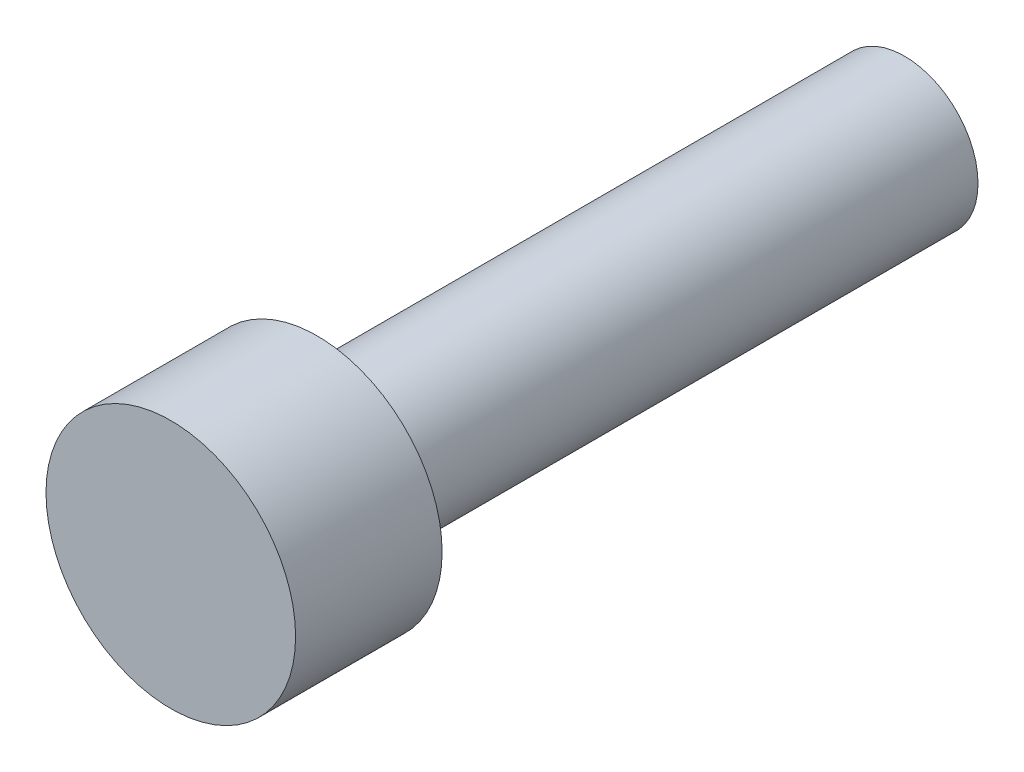
ISO-10303-21;
HEADER;
FILE_DESCRIPTION(('STEP AP214'),'2;1');
FILE_NAME('part.step','',(''),(''),'','','');
FILE_SCHEMA(('AUTOMOTIVE_DESIGN { 1 0 10303 214 1 1 1 1 }'));
ENDSEC;
DATA;
#1=APPLICATION_CONTEXT('core data for automotive mechanical design processes');
#2=APPLICATION_PROTOCOL_DEFINITION('international standard','automotive_design',2000,#1);
#3=PRODUCT_CONTEXT('',#1,'mechanical');
#4=PRODUCT('Part','Part','',(#3));
#5=PRODUCT_RELATED_PRODUCT_CATEGORY('part','',(#4));
#6=PRODUCT_DEFINITION_FORMATION('','',#4);
#7=PRODUCT_DEFINITION_CONTEXT('part definition',#1,'design');
#8=PRODUCT_DEFINITION('design','',#6,#7);
#9=PRODUCT_DEFINITION_SHAPE('','',#8);
#10=(LENGTH_UNIT() NAMED_UNIT(*) SI_UNIT(.MILLI.,.METRE.));
#11=(NAMED_UNIT(*) PLANE_ANGLE_UNIT() SI_UNIT($,.RADIAN.));
#12=(NAMED_UNIT(*) SI_UNIT($,.STERADIAN.) SOLID_ANGLE_UNIT());
#13=UNCERTAINTY_MEASURE_WITH_UNIT(LENGTH_MEASURE(1.E-05),#10,'distance_accuracy_value','');
#14=(GEOMETRIC_REPRESENTATION_CONTEXT(3) GLOBAL_UNCERTAINTY_ASSIGNED_CONTEXT((#13)) GLOBAL_UNIT_ASSIGNED_CONTEXT((#10,
#11,#12)) REPRESENTATION_CONTEXT('',''));
#15=CARTESIAN_POINT('',(0.,0.,0.));
#16=DIRECTION('',(0.,0.,1.));
#17=DIRECTION('',(1.,0.,0.));
#18=AXIS2_PLACEMENT_3D('',#15,#16,#17);
#19=CARTESIAN_POINT('',(0.,0.,-20.));
#20=DIRECTION('',(0.,0.,1.));
#21=DIRECTION('',(1.,0.,0.));
#22=AXIS2_PLACEMENT_3D('',#19,#20,#21);
#23=CYLINDRICAL_SURFACE('',#22,2.5);
#24=CARTESIAN_POINT('',(0.,0.,-20.));
#25=DIRECTION('',(0.,0.,1.));
#26=DIRECTION('',(1.,0.,0.));
#27=AXIS2_PLACEMENT_3D('',#24,#25,#26);
#28=CIRCLE('',#27,2.5);
#29=CARTESIAN_POINT('',(2.5,0.,-20.));
#30=VERTEX_POINT('',#29);
#31=EDGE_CURVE('E10',#30,#30,#28,.T.);
#32=ORIENTED_EDGE('',*,*,#31,.T.);
#33=EDGE_LOOP('',(#32));
#34=FACE_BOUND('',#33,.T.);
#35=CARTESIAN_POINT('',(0.,0.,0.));
#36=DIRECTION('',(0.,0.,1.));
#37=DIRECTION('',(1.,0.,0.));
#38=AXIS2_PLACEMENT_3D('',#35,#36,#37);
#39=CIRCLE('',#38,2.5);
#40=CARTESIAN_POINT('',(2.5,0.,0.));
#41=VERTEX_POINT('',#40);
#42=EDGE_CURVE('E48',#41,#41,#39,.T.);
#43=ORIENTED_EDGE('',*,*,#42,.F.);
#44=EDGE_LOOP('',(#43));
#45=FACE_BOUND('',#44,.T.);
#46=ADVANCED_FACE('F45',(#34,#45),#23,.T.);
#47=CARTESIAN_POINT('',(0.,0.,-20.));
#48=DIRECTION('',(0.,0.,1.));
#49=DIRECTION('',(1.,0.,0.));
#50=AXIS2_PLACEMENT_3D('',#47,#48,#49);
#51=PLANE('',#50);
#52=ORIENTED_EDGE('',*,*,#31,.F.);
#53=EDGE_LOOP('',(#52));
#54=FACE_BOUND('',#53,.T.);
#55=ADVANCED_FACE('F72',(#54),#51,.F.);
#56=CARTESIAN_POINT('',(0.,0.,4.99));
#57=DIRECTION('',(0.,0.,-1.));
#58=DIRECTION('',(-1.,0.,0.));
#59=AXIS2_PLACEMENT_3D('',#56,#57,#58);
#60=CYLINDRICAL_SURFACE('',#59,4.25);
#61=CARTESIAN_POINT('',(0.,0.,4.99));
#62=DIRECTION('',(0.,0.,1.));
#63=DIRECTION('',(1.,0.,0.));
#64=AXIS2_PLACEMENT_3D('',#61,#62,#63);
#65=CIRCLE('',#64,4.25);
#66=CARTESIAN_POINT('',(4.25,0.,4.99));
#67=VERTEX_POINT('',#66);
#68=EDGE_CURVE('E59',#67,#67,#65,.T.);
#69=ORIENTED_EDGE('',*,*,#68,.F.);
#70=EDGE_LOOP('',(#69));
#71=FACE_BOUND('',#70,.T.);
#72=CARTESIAN_POINT('',(0.,0.,0.));
#73=DIRECTION('',(0.,0.,1.));
#74=DIRECTION('',(1.,0.,0.));
#75=AXIS2_PLACEMENT_3D('',#72,#73,#74);
#76=CIRCLE('',#75,4.25);
#77=CARTESIAN_POINT('',(4.25,0.,0.));
#78=VERTEX_POINT('',#77);
#79=EDGE_CURVE('E61',#78,#78,#76,.T.);
#80=ORIENTED_EDGE('',*,*,#79,.T.);
#81=EDGE_LOOP('',(#80));
#82=FACE_BOUND('',#81,.T.);
#83=ADVANCED_FACE('F69',(#71,#82),#60,.T.);
#84=CARTESIAN_POINT('',(0.,0.,4.99));
#85=DIRECTION('',(0.,0.,1.));
#86=DIRECTION('',(1.,0.,0.));
#87=AXIS2_PLACEMENT_3D('',#84,#85,#86);
#88=PLANE('',#87);
#89=ORIENTED_EDGE('',*,*,#68,.T.);
#90=EDGE_LOOP('',(#89));
#91=FACE_BOUND('',#90,.T.);
#92=ADVANCED_FACE('F67',(#91),#88,.T.);
#93=CARTESIAN_POINT('',(0.,0.,0.));
#94=DIRECTION('',(0.,0.,1.));
#95=DIRECTION('',(1.,0.,0.));
#96=AXIS2_PLACEMENT_3D('',#93,#94,#95);
#97=PLANE('',#96);
#98=ORIENTED_EDGE('',*,*,#42,.T.);
#99=EDGE_LOOP('',(#98));
#100=FACE_BOUND('',#99,.T.);
#101=ORIENTED_EDGE('',*,*,#79,.F.);
#102=EDGE_LOOP('',(#101));
#103=FACE_BOUND('',#102,.T.);
#104=ADVANCED_FACE('F76',(#100,#103),#97,.F.);
#105=CLOSED_SHELL('',(#46,#55,#83,#92,#104));
#106=MANIFOLD_SOLID_BREP('B2',#105);
#107=ADVANCED_BREP_SHAPE_REPRESENTATION('',(#18,#106),#14);
#108=SHAPE_DEFINITION_REPRESENTATION(#9,#107);
ENDSEC;
END-ISO-10303-21;
